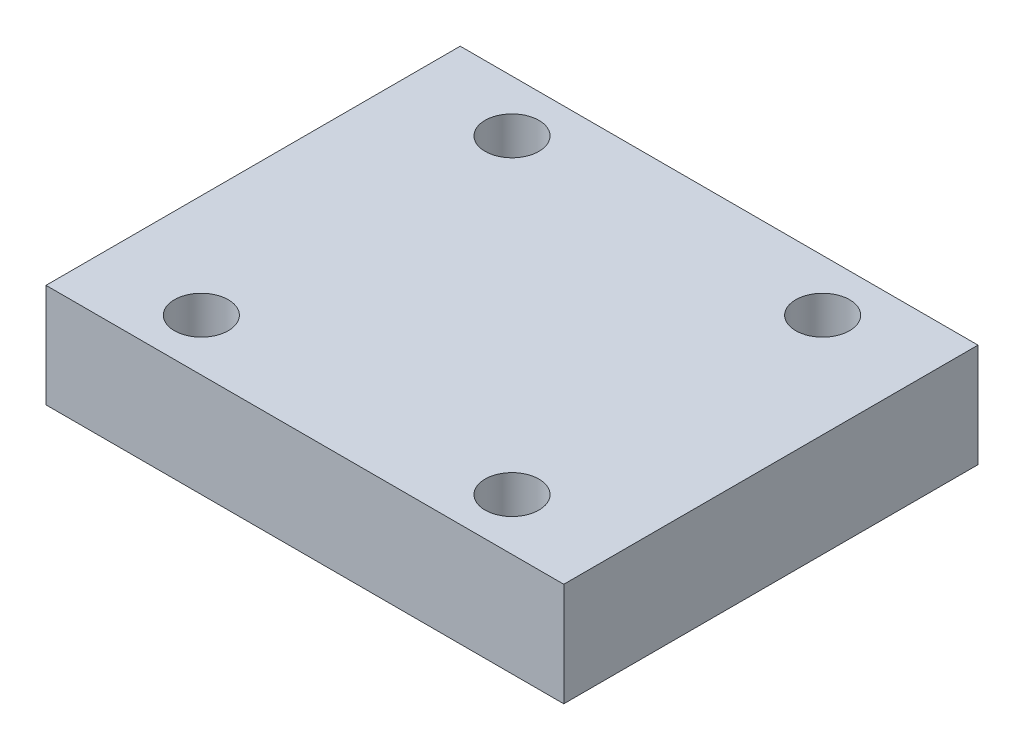
ISO-10303-21;
HEADER;
FILE_DESCRIPTION(('STEP AP214'),'2;1');
FILE_NAME('part.step','',(''),(''),'','','');
FILE_SCHEMA(('AUTOMOTIVE_DESIGN { 1 0 10303 214 1 1 1 1 }'));
ENDSEC;
DATA;
#1=APPLICATION_CONTEXT('core data for automotive mechanical design processes');
#2=APPLICATION_PROTOCOL_DEFINITION('international standard','automotive_design',2000,#1);
#3=PRODUCT_CONTEXT('',#1,'mechanical');
#4=PRODUCT('Part','Part','',(#3));
#5=PRODUCT_RELATED_PRODUCT_CATEGORY('part','',(#4));
#6=PRODUCT_DEFINITION_FORMATION('','',#4);
#7=PRODUCT_DEFINITION_CONTEXT('part definition',#1,'design');
#8=PRODUCT_DEFINITION('design','',#6,#7);
#9=PRODUCT_DEFINITION_SHAPE('','',#8);
#10=(LENGTH_UNIT() NAMED_UNIT(*) SI_UNIT(.MILLI.,.METRE.));
#11=(NAMED_UNIT(*) PLANE_ANGLE_UNIT() SI_UNIT($,.RADIAN.));
#12=(NAMED_UNIT(*) SI_UNIT($,.STERADIAN.) SOLID_ANGLE_UNIT());
#13=UNCERTAINTY_MEASURE_WITH_UNIT(LENGTH_MEASURE(1.E-05),#10,'distance_accuracy_value','');
#14=(GEOMETRIC_REPRESENTATION_CONTEXT(3) GLOBAL_UNCERTAINTY_ASSIGNED_CONTEXT((#13)) GLOBAL_UNIT_ASSIGNED_CONTEXT((#10,
#11,#12)) REPRESENTATION_CONTEXT('',''));
#15=CARTESIAN_POINT('',(0.,0.,0.));
#16=DIRECTION('',(0.,0.,1.));
#17=DIRECTION('',(1.,0.,0.));
#18=AXIS2_PLACEMENT_3D('',#15,#16,#17);
#19=CARTESIAN_POINT('',(0.,10.,0.));
#20=DIRECTION('',(0.,-1.,0.));
#21=DIRECTION('',(0.,0.,-1.));
#22=AXIS2_PLACEMENT_3D('',#19,#20,#21);
#23=PLANE('',#22);
#24=DIRECTION('',(0.,0.,-1.));
#25=VECTOR('',#24,1.);
#26=CARTESIAN_POINT('',(25.,10.,20.));
#27=LINE('',#26,#25);
#28=CARTESIAN_POINT('',(25.,10.,20.));
#29=VERTEX_POINT('',#28);
#30=CARTESIAN_POINT('',(25.,10.,-20.));
#31=VERTEX_POINT('',#30);
#32=EDGE_CURVE('E93',#29,#31,#27,.T.);
#33=ORIENTED_EDGE('',*,*,#32,.T.);
#34=DIRECTION('',(-1.,0.,0.));
#35=VECTOR('',#34,1.);
#36=CARTESIAN_POINT('',(-25.,10.,-20.));
#37=LINE('',#36,#35);
#38=CARTESIAN_POINT('',(-25.,10.,-20.));
#39=VERTEX_POINT('',#38);
#40=EDGE_CURVE('E88',#31,#39,#37,.T.);
#41=ORIENTED_EDGE('',*,*,#40,.T.);
#42=DIRECTION('',(0.,0.,1.));
#43=VECTOR('',#42,1.);
#44=CARTESIAN_POINT('',(-25.,10.,20.));
#45=LINE('',#44,#43);
#46=CARTESIAN_POINT('',(-25.,10.,20.));
#47=VERTEX_POINT('',#46);
#48=EDGE_CURVE('E91',#39,#47,#45,.T.);
#49=ORIENTED_EDGE('',*,*,#48,.T.);
#50=DIRECTION('',(1.,0.,0.));
#51=VECTOR('',#50,1.);
#52=CARTESIAN_POINT('',(-25.,10.,20.));
#53=LINE('',#52,#51);
#54=EDGE_CURVE('E58',#47,#29,#53,.T.);
#55=ORIENTED_EDGE('',*,*,#54,.T.);
#56=EDGE_LOOP('',(#33,#41,#49,#55));
#57=FACE_BOUND('',#56,.T.);
#58=CARTESIAN_POINT('',(-15.,10.,-15.));
#59=DIRECTION('',(0.,1.,0.));
#60=DIRECTION('',(0.,0.,1.));
#61=AXIS2_PLACEMENT_3D('',#58,#59,#60);
#62=CIRCLE('',#61,2.6);
#63=CARTESIAN_POINT('',(-15.,10.,-12.4));
#64=VERTEX_POINT('',#63);
#65=EDGE_CURVE('E108',#64,#64,#62,.T.);
#66=ORIENTED_EDGE('',*,*,#65,.F.);
#67=EDGE_LOOP('',(#66));
#68=FACE_BOUND('',#67,.T.);
#69=CARTESIAN_POINT('',(-15.,10.,15.));
#70=DIRECTION('',(0.,1.,0.));
#71=DIRECTION('',(0.,0.,-1.));
#72=AXIS2_PLACEMENT_3D('',#69,#70,#71);
#73=CIRCLE('',#72,2.6);
#74=CARTESIAN_POINT('',(-15.,10.,12.4));
#75=VERTEX_POINT('',#74);
#76=EDGE_CURVE('E123',#75,#75,#73,.T.);
#77=ORIENTED_EDGE('',*,*,#76,.F.);
#78=EDGE_LOOP('',(#77));
#79=FACE_BOUND('',#78,.T.);
#80=CARTESIAN_POINT('',(15.,10.,15.));
#81=DIRECTION('',(0.,1.,0.));
#82=DIRECTION('',(0.,0.,1.));
#83=AXIS2_PLACEMENT_3D('',#80,#81,#82);
#84=CIRCLE('',#83,2.6);
#85=CARTESIAN_POINT('',(15.,10.,17.6));
#86=VERTEX_POINT('',#85);
#87=EDGE_CURVE('E129',#86,#86,#84,.T.);
#88=ORIENTED_EDGE('',*,*,#87,.F.);
#89=EDGE_LOOP('',(#88));
#90=FACE_BOUND('',#89,.T.);
#91=CARTESIAN_POINT('',(15.,10.,-15.));
#92=DIRECTION('',(0.,1.,0.));
#93=DIRECTION('',(0.,0.,-1.));
#94=AXIS2_PLACEMENT_3D('',#91,#92,#93);
#95=CIRCLE('',#94,2.6);
#96=CARTESIAN_POINT('',(15.,10.,-17.6));
#97=VERTEX_POINT('',#96);
#98=EDGE_CURVE('E135',#97,#97,#95,.T.);
#99=ORIENTED_EDGE('',*,*,#98,.F.);
#100=EDGE_LOOP('',(#99));
#101=FACE_BOUND('',#100,.T.);
#102=ADVANCED_FACE('F41',(#57,#68,#79,#90,#101),#23,.F.);
#103=CARTESIAN_POINT('',(0.,0.,0.));
#104=DIRECTION('',(0.,-1.,0.));
#105=DIRECTION('',(0.,0.,-1.));
#106=AXIS2_PLACEMENT_3D('',#103,#104,#105);
#107=PLANE('',#106);
#108=CARTESIAN_POINT('',(15.,0.,15.));
#109=DIRECTION('',(0.,1.,0.));
#110=DIRECTION('',(0.,0.,1.));
#111=AXIS2_PLACEMENT_3D('',#108,#109,#110);
#112=CIRCLE('',#111,2.6);
#113=CARTESIAN_POINT('',(15.,0.,17.6));
#114=VERTEX_POINT('',#113);
#115=EDGE_CURVE('E132',#114,#114,#112,.T.);
#116=ORIENTED_EDGE('',*,*,#115,.T.);
#117=EDGE_LOOP('',(#116));
#118=FACE_BOUND('',#117,.T.);
#119=CARTESIAN_POINT('',(-15.,0.,-15.));
#120=DIRECTION('',(0.,1.,0.));
#121=DIRECTION('',(0.,0.,1.));
#122=AXIS2_PLACEMENT_3D('',#119,#120,#121);
#123=CIRCLE('',#122,2.6);
#124=CARTESIAN_POINT('',(-15.,0.,-12.4));
#125=VERTEX_POINT('',#124);
#126=EDGE_CURVE('E120',#125,#125,#123,.T.);
#127=ORIENTED_EDGE('',*,*,#126,.T.);
#128=EDGE_LOOP('',(#127));
#129=FACE_BOUND('',#128,.T.);
#130=DIRECTION('',(0.,0.,-1.));
#131=VECTOR('',#130,1.);
#132=CARTESIAN_POINT('',(25.,0.,20.));
#133=LINE('',#132,#131);
#134=CARTESIAN_POINT('',(25.,0.,20.));
#135=VERTEX_POINT('',#134);
#136=CARTESIAN_POINT('',(25.,0.,-20.));
#137=VERTEX_POINT('',#136);
#138=EDGE_CURVE('E105',#135,#137,#133,.T.);
#139=ORIENTED_EDGE('',*,*,#138,.F.);
#140=DIRECTION('',(1.,0.,0.));
#141=VECTOR('',#140,1.);
#142=CARTESIAN_POINT('',(-25.,0.,20.));
#143=LINE('',#142,#141);
#144=CARTESIAN_POINT('',(-25.,0.,20.));
#145=VERTEX_POINT('',#144);
#146=EDGE_CURVE('E81',#145,#135,#143,.T.);
#147=ORIENTED_EDGE('',*,*,#146,.F.);
#148=DIRECTION('',(0.,0.,1.));
#149=VECTOR('',#148,1.);
#150=CARTESIAN_POINT('',(-25.,0.,20.));
#151=LINE('',#150,#149);
#152=CARTESIAN_POINT('',(-25.,0.,-20.));
#153=VERTEX_POINT('',#152);
#154=EDGE_CURVE('E75',#153,#145,#151,.T.);
#155=ORIENTED_EDGE('',*,*,#154,.F.);
#156=DIRECTION('',(-1.,0.,0.));
#157=VECTOR('',#156,1.);
#158=CARTESIAN_POINT('',(-25.,0.,-20.));
#159=LINE('',#158,#157);
#160=EDGE_CURVE('E97',#137,#153,#159,.T.);
#161=ORIENTED_EDGE('',*,*,#160,.F.);
#162=EDGE_LOOP('',(#139,#147,#155,#161));
#163=FACE_BOUND('',#162,.T.);
#164=CARTESIAN_POINT('',(-15.,0.,15.));
#165=DIRECTION('',(0.,1.,0.));
#166=DIRECTION('',(0.,0.,-1.));
#167=AXIS2_PLACEMENT_3D('',#164,#165,#166);
#168=CIRCLE('',#167,2.6);
#169=CARTESIAN_POINT('',(-15.,0.,12.4));
#170=VERTEX_POINT('',#169);
#171=EDGE_CURVE('E126',#170,#170,#168,.T.);
#172=ORIENTED_EDGE('',*,*,#171,.T.);
#173=EDGE_LOOP('',(#172));
#174=FACE_BOUND('',#173,.T.);
#175=CARTESIAN_POINT('',(15.,0.,-15.));
#176=DIRECTION('',(0.,1.,0.));
#177=DIRECTION('',(0.,0.,-1.));
#178=AXIS2_PLACEMENT_3D('',#175,#176,#177);
#179=CIRCLE('',#178,2.6);
#180=CARTESIAN_POINT('',(15.,0.,-17.6));
#181=VERTEX_POINT('',#180);
#182=EDGE_CURVE('E138',#181,#181,#179,.T.);
#183=ORIENTED_EDGE('',*,*,#182,.T.);
#184=EDGE_LOOP('',(#183));
#185=FACE_BOUND('',#184,.T.);
#186=ADVANCED_FACE('F116',(#118,#129,#163,#174,#185),#107,.T.);
#187=CARTESIAN_POINT('',(25.,10.,20.));
#188=DIRECTION('',(-1.,0.,0.));
#189=DIRECTION('',(0.,0.,1.));
#190=AXIS2_PLACEMENT_3D('',#187,#188,#189);
#191=PLANE('',#190);
#192=ORIENTED_EDGE('',*,*,#138,.T.);
#193=DIRECTION('',(0.,-1.,0.));
#194=VECTOR('',#193,1.);
#195=CARTESIAN_POINT('',(25.,10.,-20.));
#196=LINE('',#195,#194);
#197=EDGE_CURVE('E11',#31,#137,#196,.T.);
#198=ORIENTED_EDGE('',*,*,#197,.F.);
#199=ORIENTED_EDGE('',*,*,#32,.F.);
#200=DIRECTION('',(0.,-1.,0.));
#201=VECTOR('',#200,1.);
#202=CARTESIAN_POINT('',(25.,10.,20.));
#203=LINE('',#202,#201);
#204=EDGE_CURVE('E101',#29,#135,#203,.T.);
#205=ORIENTED_EDGE('',*,*,#204,.T.);
#206=EDGE_LOOP('',(#192,#198,#199,#205));
#207=FACE_BOUND('',#206,.T.);
#208=ADVANCED_FACE('F43',(#207),#191,.F.);
#209=CARTESIAN_POINT('',(-25.,10.,-20.));
#210=DIRECTION('',(0.,0.,1.));
#211=DIRECTION('',(1.,0.,0.));
#212=AXIS2_PLACEMENT_3D('',#209,#210,#211);
#213=PLANE('',#212);
#214=ORIENTED_EDGE('',*,*,#160,.T.);
#215=DIRECTION('',(0.,-1.,0.));
#216=VECTOR('',#215,1.);
#217=CARTESIAN_POINT('',(-25.,10.,-20.));
#218=LINE('',#217,#216);
#219=EDGE_CURVE('E50',#39,#153,#218,.T.);
#220=ORIENTED_EDGE('',*,*,#219,.F.);
#221=ORIENTED_EDGE('',*,*,#40,.F.);
#222=ORIENTED_EDGE('',*,*,#197,.T.);
#223=EDGE_LOOP('',(#214,#220,#221,#222));
#224=FACE_BOUND('',#223,.T.);
#225=ADVANCED_FACE('F96',(#224),#213,.F.);
#226=CARTESIAN_POINT('',(-25.,10.,20.));
#227=DIRECTION('',(1.,0.,0.));
#228=DIRECTION('',(0.,0.,-1.));
#229=AXIS2_PLACEMENT_3D('',#226,#227,#228);
#230=PLANE('',#229);
#231=ORIENTED_EDGE('',*,*,#154,.T.);
#232=DIRECTION('',(0.,-1.,0.));
#233=VECTOR('',#232,1.);
#234=CARTESIAN_POINT('',(-25.,10.,20.));
#235=LINE('',#234,#233);
#236=EDGE_CURVE('E98',#47,#145,#235,.T.);
#237=ORIENTED_EDGE('',*,*,#236,.F.);
#238=ORIENTED_EDGE('',*,*,#48,.F.);
#239=ORIENTED_EDGE('',*,*,#219,.T.);
#240=EDGE_LOOP('',(#231,#237,#238,#239));
#241=FACE_BOUND('',#240,.T.);
#242=ADVANCED_FACE('F99',(#241),#230,.F.);
#243=CARTESIAN_POINT('',(-25.,10.,20.));
#244=DIRECTION('',(0.,0.,-1.));
#245=DIRECTION('',(-1.,0.,0.));
#246=AXIS2_PLACEMENT_3D('',#243,#244,#245);
#247=PLANE('',#246);
#248=ORIENTED_EDGE('',*,*,#146,.T.);
#249=ORIENTED_EDGE('',*,*,#204,.F.);
#250=ORIENTED_EDGE('',*,*,#54,.F.);
#251=ORIENTED_EDGE('',*,*,#236,.T.);
#252=EDGE_LOOP('',(#248,#249,#250,#251));
#253=FACE_BOUND('',#252,.T.);
#254=ADVANCED_FACE('F113',(#253),#247,.F.);
#255=CARTESIAN_POINT('',(-15.,10.,-15.));
#256=DIRECTION('',(0.,-1.,0.));
#257=DIRECTION('',(0.,0.,-1.));
#258=AXIS2_PLACEMENT_3D('',#255,#256,#257);
#259=CYLINDRICAL_SURFACE('',#258,2.6);
#260=ORIENTED_EDGE('',*,*,#65,.T.);
#261=EDGE_LOOP('',(#260));
#262=FACE_BOUND('',#261,.T.);
#263=ORIENTED_EDGE('',*,*,#126,.F.);
#264=EDGE_LOOP('',(#263));
#265=FACE_BOUND('',#264,.T.);
#266=ADVANCED_FACE('F155',(#262,#265),#259,.F.);
#267=CARTESIAN_POINT('',(-15.,10.,15.));
#268=DIRECTION('',(0.,-1.,0.));
#269=DIRECTION('',(0.,0.,-1.));
#270=AXIS2_PLACEMENT_3D('',#267,#268,#269);
#271=CYLINDRICAL_SURFACE('',#270,2.6);
#272=ORIENTED_EDGE('',*,*,#76,.T.);
#273=EDGE_LOOP('',(#272));
#274=FACE_BOUND('',#273,.T.);
#275=ORIENTED_EDGE('',*,*,#171,.F.);
#276=EDGE_LOOP('',(#275));
#277=FACE_BOUND('',#276,.T.);
#278=ADVANCED_FACE('F200',(#274,#277),#271,.F.);
#279=CARTESIAN_POINT('',(15.,10.,15.));
#280=DIRECTION('',(0.,-1.,0.));
#281=DIRECTION('',(0.,0.,-1.));
#282=AXIS2_PLACEMENT_3D('',#279,#280,#281);
#283=CYLINDRICAL_SURFACE('',#282,2.6);
#284=ORIENTED_EDGE('',*,*,#87,.T.);
#285=EDGE_LOOP('',(#284));
#286=FACE_BOUND('',#285,.T.);
#287=ORIENTED_EDGE('',*,*,#115,.F.);
#288=EDGE_LOOP('',(#287));
#289=FACE_BOUND('',#288,.T.);
#290=ADVANCED_FACE('F208',(#286,#289),#283,.F.);
#291=CARTESIAN_POINT('',(15.,10.,-15.));
#292=DIRECTION('',(0.,-1.,0.));
#293=DIRECTION('',(0.,0.,-1.));
#294=AXIS2_PLACEMENT_3D('',#291,#292,#293);
#295=CYLINDRICAL_SURFACE('',#294,2.6);
#296=ORIENTED_EDGE('',*,*,#98,.T.);
#297=EDGE_LOOP('',(#296));
#298=FACE_BOUND('',#297,.T.);
#299=ORIENTED_EDGE('',*,*,#182,.F.);
#300=EDGE_LOOP('',(#299));
#301=FACE_BOUND('',#300,.T.);
#302=ADVANCED_FACE('F144',(#298,#301),#295,.F.);
#303=CLOSED_SHELL('',(#102,#186,#208,#225,#242,#254,#266,#278,#290,#302));
#304=MANIFOLD_SOLID_BREP('B2',#303);
#305=ADVANCED_BREP_SHAPE_REPRESENTATION('',(#18,#304),#14);
#306=SHAPE_DEFINITION_REPRESENTATION(#9,#305);
ENDSEC;
END-ISO-10303-21;
